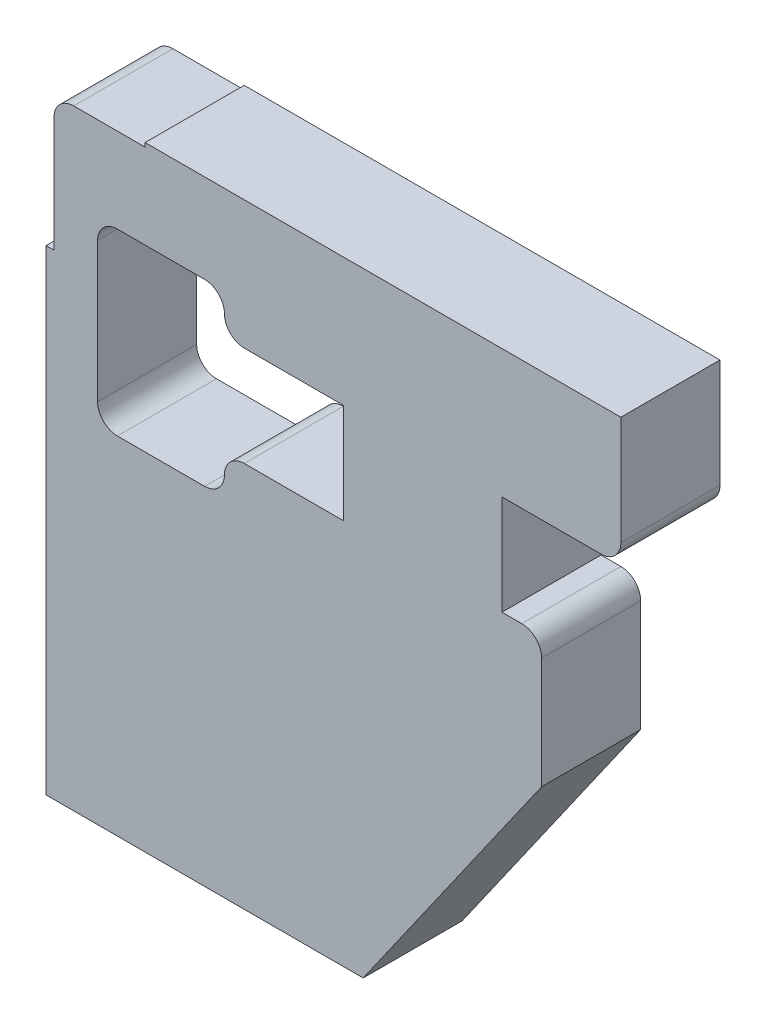
ISO-10303-21;
HEADER;
FILE_DESCRIPTION(('STEP AP214'),'2;1');
FILE_NAME('part.step','',(''),(''),'','','');
FILE_SCHEMA(('AUTOMOTIVE_DESIGN { 1 0 10303 214 1 1 1 1 }'));
ENDSEC;
DATA;
#1=APPLICATION_CONTEXT('core data for automotive mechanical design processes');
#2=APPLICATION_PROTOCOL_DEFINITION('international standard','automotive_design',2000,#1);
#3=PRODUCT_CONTEXT('',#1,'mechanical');
#4=PRODUCT('Part','Part','',(#3));
#5=PRODUCT_RELATED_PRODUCT_CATEGORY('part','',(#4));
#6=PRODUCT_DEFINITION_FORMATION('','',#4);
#7=PRODUCT_DEFINITION_CONTEXT('part definition',#1,'design');
#8=PRODUCT_DEFINITION('design','',#6,#7);
#9=PRODUCT_DEFINITION_SHAPE('','',#8);
#10=(LENGTH_UNIT() NAMED_UNIT(*) SI_UNIT(.MILLI.,.METRE.));
#11=(NAMED_UNIT(*) PLANE_ANGLE_UNIT() SI_UNIT($,.RADIAN.));
#12=(NAMED_UNIT(*) SI_UNIT($,.STERADIAN.) SOLID_ANGLE_UNIT());
#13=UNCERTAINTY_MEASURE_WITH_UNIT(LENGTH_MEASURE(1.E-05),#10,'distance_accuracy_value','');
#14=(GEOMETRIC_REPRESENTATION_CONTEXT(3) GLOBAL_UNCERTAINTY_ASSIGNED_CONTEXT((#13)) GLOBAL_UNIT_ASSIGNED_CONTEXT((#10,
#11,#12)) REPRESENTATION_CONTEXT('',''));
#15=CARTESIAN_POINT('',(0.,0.,0.));
#16=DIRECTION('',(0.,0.,1.));
#17=DIRECTION('',(1.,0.,0.));
#18=AXIS2_PLACEMENT_3D('',#15,#16,#17);
#19=CARTESIAN_POINT('',(0.,0.,0.125));
#20=DIRECTION('',(0.,0.,-1.));
#21=DIRECTION('',(-1.,0.,0.));
#22=AXIS2_PLACEMENT_3D('',#19,#20,#21);
#23=PLANE('',#22);
#24=DIRECTION('',(0.,1.,0.));
#25=VECTOR('',#24,1.);
#26=CARTESIAN_POINT('',(1.3,-0.957333396966045,0.125));
#27=LINE('',#26,#25);
#28=CARTESIAN_POINT('',(1.3,-0.957333396966045,0.125));
#29=VERTEX_POINT('',#28);
#30=CARTESIAN_POINT('',(1.3,-0.676,0.125));
#31=VERTEX_POINT('',#30);
#32=EDGE_CURVE('E290',#29,#31,#27,.T.);
#33=ORIENTED_EDGE('',*,*,#32,.T.);
#34=CARTESIAN_POINT('',(1.25,-0.676,0.125));
#35=DIRECTION('',(0.,0.,-1.));
#36=DIRECTION('',(-1.,0.,0.));
#37=AXIS2_PLACEMENT_3D('',#34,#35,#36);
#38=CIRCLE('',#37,0.05);
#39=CARTESIAN_POINT('',(1.25,-0.626,0.125));
#40=VERTEX_POINT('',#39);
#41=EDGE_CURVE('E379',#31,#40,#38,.F.);
#42=ORIENTED_EDGE('',*,*,#41,.T.);
#43=DIRECTION('',(-1.,0.,0.));
#44=VECTOR('',#43,1.);
#45=CARTESIAN_POINT('',(1.3,-0.626,0.125));
#46=LINE('',#45,#44);
#47=CARTESIAN_POINT('',(1.2,-0.626,0.125));
#48=VERTEX_POINT('',#47);
#49=EDGE_CURVE('E293',#40,#48,#46,.T.);
#50=ORIENTED_EDGE('',*,*,#49,.T.);
#51=DIRECTION('',(0.,1.,0.));
#52=VECTOR('',#51,1.);
#53=CARTESIAN_POINT('',(1.2,-0.626,0.125));
#54=LINE('',#53,#52);
#55=CARTESIAN_POINT('',(1.2,-0.374,0.125));
#56=VERTEX_POINT('',#55);
#57=EDGE_CURVE('E295',#48,#56,#54,.T.);
#58=ORIENTED_EDGE('',*,*,#57,.T.);
#59=DIRECTION('',(1.,0.,0.));
#60=VECTOR('',#59,1.);
#61=CARTESIAN_POINT('',(1.2,-0.374,0.125));
#62=LINE('',#61,#60);
#63=CARTESIAN_POINT('',(1.45,-0.374,0.125));
#64=VERTEX_POINT('',#63);
#65=EDGE_CURVE('E297',#56,#64,#62,.T.);
#66=ORIENTED_EDGE('',*,*,#65,.T.);
#67=CARTESIAN_POINT('',(1.45,-0.324,0.125));
#68=DIRECTION('',(0.,0.,-1.));
#69=DIRECTION('',(-1.,0.,0.));
#70=AXIS2_PLACEMENT_3D('',#67,#68,#69);
#71=CIRCLE('',#70,0.05);
#72=CARTESIAN_POINT('',(1.5,-0.324,0.125));
#73=VERTEX_POINT('',#72);
#74=EDGE_CURVE('E377',#64,#73,#71,.F.);
#75=ORIENTED_EDGE('',*,*,#74,.T.);
#76=DIRECTION('',(0.,1.,0.));
#77=VECTOR('',#76,1.);
#78=CARTESIAN_POINT('',(1.5,-0.374,0.125));
#79=LINE('',#78,#77);
#80=CARTESIAN_POINT('',(1.5,-0.05,0.125));
#81=VERTEX_POINT('',#80);
#82=EDGE_CURVE('E270',#73,#81,#79,.T.);
#83=ORIENTED_EDGE('',*,*,#82,.T.);
#84=DIRECTION('',(-1.,0.,0.));
#85=VECTOR('',#84,1.);
#86=CARTESIAN_POINT('',(0.3,-0.05,0.125));
#87=LINE('',#86,#85);
#88=CARTESIAN_POINT('',(0.3,-0.05,0.125));
#89=VERTEX_POINT('',#88);
#90=EDGE_CURVE('E272',#81,#89,#87,.T.);
#91=ORIENTED_EDGE('',*,*,#90,.T.);
#92=DIRECTION('',(0.,-1.,0.));
#93=VECTOR('',#92,1.);
#94=CARTESIAN_POINT('',(0.3,-0.05,0.125));
#95=LINE('',#94,#93);
#96=CARTESIAN_POINT('',(0.3,-0.06,0.125));
#97=VERTEX_POINT('',#96);
#98=EDGE_CURVE('E275',#89,#97,#95,.T.);
#99=ORIENTED_EDGE('',*,*,#98,.T.);
#100=DIRECTION('',(-1.,0.,0.));
#101=VECTOR('',#100,1.);
#102=CARTESIAN_POINT('',(0.3,-0.06,0.125));
#103=LINE('',#102,#101);
#104=CARTESIAN_POINT('',(0.12,-0.06,0.125));
#105=VERTEX_POINT('',#104);
#106=EDGE_CURVE('E277',#97,#105,#103,.T.);
#107=ORIENTED_EDGE('',*,*,#106,.T.);
#108=CARTESIAN_POINT('',(0.12,-0.11,0.125));
#109=DIRECTION('',(0.,0.,-1.));
#110=DIRECTION('',(-1.,0.,0.));
#111=AXIS2_PLACEMENT_3D('',#108,#109,#110);
#112=CIRCLE('',#111,0.05);
#113=CARTESIAN_POINT('',(0.07,-0.11,0.125));
#114=VERTEX_POINT('',#113);
#115=EDGE_CURVE('E372',#105,#114,#112,.F.);
#116=ORIENTED_EDGE('',*,*,#115,.T.);
#117=DIRECTION('',(0.,-1.,0.));
#118=VECTOR('',#117,1.);
#119=CARTESIAN_POINT('',(0.07,-0.06,0.125));
#120=LINE('',#119,#118);
#121=CARTESIAN_POINT('',(0.07,-0.4,0.125));
#122=VERTEX_POINT('',#121);
#123=EDGE_CURVE('E280',#114,#122,#120,.T.);
#124=ORIENTED_EDGE('',*,*,#123,.T.);
#125=DIRECTION('',(-1.,0.,0.));
#126=VECTOR('',#125,1.);
#127=CARTESIAN_POINT('',(0.05,-0.4,0.125));
#128=LINE('',#127,#126);
#129=CARTESIAN_POINT('',(0.05,-0.4,0.125));
#130=VERTEX_POINT('',#129);
#131=EDGE_CURVE('E282',#122,#130,#128,.T.);
#132=ORIENTED_EDGE('',*,*,#131,.T.);
#133=DIRECTION('',(0.,-1.,0.));
#134=VECTOR('',#133,1.);
#135=CARTESIAN_POINT('',(0.05,-0.4,0.125));
#136=LINE('',#135,#134);
#137=CARTESIAN_POINT('',(0.0500000000000001,-1.6,0.125));
#138=VERTEX_POINT('',#137);
#139=EDGE_CURVE('E284',#130,#138,#136,.T.);
#140=ORIENTED_EDGE('',*,*,#139,.T.);
#141=DIRECTION('',(1.,0.,0.));
#142=VECTOR('',#141,1.);
#143=CARTESIAN_POINT('',(0.0500000000000001,-1.6,0.125));
#144=LINE('',#143,#142);
#145=CARTESIAN_POINT('',(0.85,-1.6,0.125));
#146=VERTEX_POINT('',#145);
#147=EDGE_CURVE('E286',#138,#146,#144,.T.);
#148=ORIENTED_EDGE('',*,*,#147,.T.);
#149=DIRECTION('',(0.573576436351044,0.819152044288993,0.));
#150=VECTOR('',#149,1.);
#151=CARTESIAN_POINT('',(0.85,-1.6,0.125));
#152=LINE('',#151,#150);
#153=EDGE_CURVE('E288',#146,#29,#152,.T.);
#154=ORIENTED_EDGE('',*,*,#153,.T.);
#155=EDGE_LOOP('',(#33,#42,#50,#58,#66,#75,#83,#91,#99,#107,#116,#124,#132,#140,#148,#154));
#156=FACE_BOUND('',#155,.T.);
#157=DIRECTION('',(-1.,0.,0.));
#158=VECTOR('',#157,1.);
#159=CARTESIAN_POINT('',(0.18,-0.274,0.125));
#160=LINE('',#159,#158);
#161=CARTESIAN_POINT('',(0.45,-0.274,0.125));
#162=VERTEX_POINT('',#161);
#163=CARTESIAN_POINT('',(0.23,-0.274,0.125));
#164=VERTEX_POINT('',#163);
#165=EDGE_CURVE('E243',#162,#164,#160,.T.);
#166=ORIENTED_EDGE('',*,*,#165,.F.);
#167=CARTESIAN_POINT('',(0.45,-0.324,0.125));
#168=DIRECTION('',(0.,0.,-1.));
#169=DIRECTION('',(-1.,0.,0.));
#170=AXIS2_PLACEMENT_3D('',#167,#168,#169);
#171=CIRCLE('',#170,0.05);
#172=CARTESIAN_POINT('',(0.5,-0.324,0.125));
#173=VERTEX_POINT('',#172);
#174=EDGE_CURVE('E55',#162,#173,#171,.T.);
#175=ORIENTED_EDGE('',*,*,#174,.T.);
#176=CARTESIAN_POINT('',(0.55,-0.324,0.125));
#177=DIRECTION('',(0.,0.,-1.));
#178=DIRECTION('',(-1.,0.,0.));
#179=AXIS2_PLACEMENT_3D('',#176,#177,#178);
#180=CIRCLE('',#179,0.05);
#181=CARTESIAN_POINT('',(0.55,-0.374,0.125));
#182=VERTEX_POINT('',#181);
#183=EDGE_CURVE('E50',#173,#182,#180,.F.);
#184=ORIENTED_EDGE('',*,*,#183,.T.);
#185=DIRECTION('',(-1.,0.,0.));
#186=VECTOR('',#185,1.);
#187=CARTESIAN_POINT('',(0.5,-0.374,0.125));
#188=LINE('',#187,#186);
#189=CARTESIAN_POINT('',(0.8,-0.374,0.125));
#190=VERTEX_POINT('',#189);
#191=EDGE_CURVE('E241',#190,#182,#188,.T.);
#192=ORIENTED_EDGE('',*,*,#191,.F.);
#193=DIRECTION('',(0.,1.,0.));
#194=VECTOR('',#193,1.);
#195=CARTESIAN_POINT('',(0.8,-0.374,0.125));
#196=LINE('',#195,#194);
#197=CARTESIAN_POINT('',(0.8,-0.626,0.125));
#198=VERTEX_POINT('',#197);
#199=EDGE_CURVE('E229',#198,#190,#196,.T.);
#200=ORIENTED_EDGE('',*,*,#199,.F.);
#201=DIRECTION('',(1.,0.,0.));
#202=VECTOR('',#201,1.);
#203=CARTESIAN_POINT('',(0.8,-0.626,0.125));
#204=LINE('',#203,#202);
#205=CARTESIAN_POINT('',(0.55,-0.626,0.125));
#206=VERTEX_POINT('',#205);
#207=EDGE_CURVE('E221',#206,#198,#204,.T.);
#208=ORIENTED_EDGE('',*,*,#207,.F.);
#209=CARTESIAN_POINT('',(0.55,-0.676,0.125));
#210=DIRECTION('',(0.,0.,-1.));
#211=DIRECTION('',(-1.,0.,0.));
#212=AXIS2_PLACEMENT_3D('',#209,#210,#211);
#213=CIRCLE('',#212,0.05);
#214=CARTESIAN_POINT('',(0.5,-0.676,0.125));
#215=VERTEX_POINT('',#214);
#216=EDGE_CURVE('E374',#206,#215,#213,.F.);
#217=ORIENTED_EDGE('',*,*,#216,.T.);
#218=CARTESIAN_POINT('',(0.45,-0.676,0.125));
#219=DIRECTION('',(0.,0.,-1.));
#220=DIRECTION('',(-1.,0.,0.));
#221=AXIS2_PLACEMENT_3D('',#218,#219,#220);
#222=CIRCLE('',#221,0.05);
#223=CARTESIAN_POINT('',(0.45,-0.726,0.125));
#224=VERTEX_POINT('',#223);
#225=EDGE_CURVE('E411',#215,#224,#222,.T.);
#226=ORIENTED_EDGE('',*,*,#225,.T.);
#227=DIRECTION('',(1.,0.,0.));
#228=VECTOR('',#227,1.);
#229=CARTESIAN_POINT('',(0.5,-0.726,0.125));
#230=LINE('',#229,#228);
#231=CARTESIAN_POINT('',(0.23,-0.726,0.125));
#232=VERTEX_POINT('',#231);
#233=EDGE_CURVE('E251',#232,#224,#230,.T.);
#234=ORIENTED_EDGE('',*,*,#233,.F.);
#235=CARTESIAN_POINT('',(0.23,-0.676,0.125));
#236=DIRECTION('',(0.,0.,-1.));
#237=DIRECTION('',(-1.,0.,0.));
#238=AXIS2_PLACEMENT_3D('',#235,#236,#237);
#239=CIRCLE('',#238,0.05);
#240=CARTESIAN_POINT('',(0.18,-0.676,0.125));
#241=VERTEX_POINT('',#240);
#242=EDGE_CURVE('E415',#232,#241,#239,.T.);
#243=ORIENTED_EDGE('',*,*,#242,.T.);
#244=DIRECTION('',(0.,-1.,0.));
#245=VECTOR('',#244,1.);
#246=CARTESIAN_POINT('',(0.18,-0.726,0.125));
#247=LINE('',#246,#245);
#248=CARTESIAN_POINT('',(0.18,-0.324,0.125));
#249=VERTEX_POINT('',#248);
#250=EDGE_CURVE('E248',#249,#241,#247,.T.);
#251=ORIENTED_EDGE('',*,*,#250,.F.);
#252=CARTESIAN_POINT('',(0.23,-0.324,0.125));
#253=DIRECTION('',(0.,0.,-1.));
#254=DIRECTION('',(-1.,0.,0.));
#255=AXIS2_PLACEMENT_3D('',#252,#253,#254);
#256=CIRCLE('',#255,0.05);
#257=EDGE_CURVE('E11',#249,#164,#256,.T.);
#258=ORIENTED_EDGE('',*,*,#257,.T.);
#259=EDGE_LOOP('',(#166,#175,#184,#192,#200,#208,#217,#226,#234,#243,#251,#258));
#260=FACE_BOUND('',#259,.T.);
#261=ADVANCED_FACE('F33',(#156,#260),#23,.F.);
#262=CARTESIAN_POINT('',(0.,0.,-0.125));
#263=DIRECTION('',(0.,0.,-1.));
#264=DIRECTION('',(-1.,0.,0.));
#265=AXIS2_PLACEMENT_3D('',#262,#263,#264);
#266=PLANE('',#265);
#267=DIRECTION('',(-1.,0.,0.));
#268=VECTOR('',#267,1.);
#269=CARTESIAN_POINT('',(1.3,-0.626,-0.125));
#270=LINE('',#269,#268);
#271=CARTESIAN_POINT('',(1.25,-0.626,-0.125));
#272=VERTEX_POINT('',#271);
#273=CARTESIAN_POINT('',(1.2,-0.626,-0.125));
#274=VERTEX_POINT('',#273);
#275=EDGE_CURVE('E322',#272,#274,#270,.T.);
#276=ORIENTED_EDGE('',*,*,#275,.F.);
#277=CARTESIAN_POINT('',(1.25,-0.676,-0.125));
#278=DIRECTION('',(0.,0.,-1.));
#279=DIRECTION('',(-1.,0.,0.));
#280=AXIS2_PLACEMENT_3D('',#277,#278,#279);
#281=CIRCLE('',#280,0.05);
#282=CARTESIAN_POINT('',(1.3,-0.676,-0.125));
#283=VERTEX_POINT('',#282);
#284=EDGE_CURVE('E368',#272,#283,#281,.T.);
#285=ORIENTED_EDGE('',*,*,#284,.T.);
#286=DIRECTION('',(0.,1.,0.));
#287=VECTOR('',#286,1.);
#288=CARTESIAN_POINT('',(1.3,-0.957333396966045,-0.125));
#289=LINE('',#288,#287);
#290=CARTESIAN_POINT('',(1.3,-0.957333396966045,-0.125));
#291=VERTEX_POINT('',#290);
#292=EDGE_CURVE('E319',#291,#283,#289,.T.);
#293=ORIENTED_EDGE('',*,*,#292,.F.);
#294=DIRECTION('',(0.573576436351044,0.819152044288993,0.));
#295=VECTOR('',#294,1.);
#296=CARTESIAN_POINT('',(0.85,-1.6,-0.125));
#297=LINE('',#296,#295);
#298=CARTESIAN_POINT('',(0.85,-1.6,-0.125));
#299=VERTEX_POINT('',#298);
#300=EDGE_CURVE('E317',#299,#291,#297,.T.);
#301=ORIENTED_EDGE('',*,*,#300,.F.);
#302=DIRECTION('',(1.,0.,0.));
#303=VECTOR('',#302,1.);
#304=CARTESIAN_POINT('',(0.0500000000000001,-1.6,-0.125));
#305=LINE('',#304,#303);
#306=CARTESIAN_POINT('',(0.0500000000000001,-1.6,-0.125));
#307=VERTEX_POINT('',#306);
#308=EDGE_CURVE('E315',#307,#299,#305,.T.);
#309=ORIENTED_EDGE('',*,*,#308,.F.);
#310=DIRECTION('',(0.,-1.,0.));
#311=VECTOR('',#310,1.);
#312=CARTESIAN_POINT('',(0.05,-0.4,-0.125));
#313=LINE('',#312,#311);
#314=CARTESIAN_POINT('',(0.05,-0.4,-0.125));
#315=VERTEX_POINT('',#314);
#316=EDGE_CURVE('E313',#315,#307,#313,.T.);
#317=ORIENTED_EDGE('',*,*,#316,.F.);
#318=DIRECTION('',(-1.,0.,0.));
#319=VECTOR('',#318,1.);
#320=CARTESIAN_POINT('',(0.05,-0.4,-0.125));
#321=LINE('',#320,#319);
#322=CARTESIAN_POINT('',(0.07,-0.4,-0.125));
#323=VERTEX_POINT('',#322);
#324=EDGE_CURVE('E311',#323,#315,#321,.T.);
#325=ORIENTED_EDGE('',*,*,#324,.F.);
#326=DIRECTION('',(0.,-1.,0.));
#327=VECTOR('',#326,1.);
#328=CARTESIAN_POINT('',(0.07,-0.06,-0.125));
#329=LINE('',#328,#327);
#330=CARTESIAN_POINT('',(0.07,-0.11,-0.125));
#331=VERTEX_POINT('',#330);
#332=EDGE_CURVE('E309',#331,#323,#329,.T.);
#333=ORIENTED_EDGE('',*,*,#332,.F.);
#334=CARTESIAN_POINT('',(0.12,-0.11,-0.125));
#335=DIRECTION('',(0.,0.,-1.));
#336=DIRECTION('',(-1.,0.,0.));
#337=AXIS2_PLACEMENT_3D('',#334,#335,#336);
#338=CIRCLE('',#337,0.05);
#339=CARTESIAN_POINT('',(0.12,-0.06,-0.125));
#340=VERTEX_POINT('',#339);
#341=EDGE_CURVE('E360',#331,#340,#338,.T.);
#342=ORIENTED_EDGE('',*,*,#341,.T.);
#343=DIRECTION('',(-1.,0.,0.));
#344=VECTOR('',#343,1.);
#345=CARTESIAN_POINT('',(0.3,-0.06,-0.125));
#346=LINE('',#345,#344);
#347=CARTESIAN_POINT('',(0.3,-0.06,-0.125));
#348=VERTEX_POINT('',#347);
#349=EDGE_CURVE('E306',#348,#340,#346,.T.);
#350=ORIENTED_EDGE('',*,*,#349,.F.);
#351=DIRECTION('',(0.,-1.,0.));
#352=VECTOR('',#351,1.);
#353=CARTESIAN_POINT('',(0.3,-0.05,-0.125));
#354=LINE('',#353,#352);
#355=CARTESIAN_POINT('',(0.3,-0.05,-0.125));
#356=VERTEX_POINT('',#355);
#357=EDGE_CURVE('E304',#356,#348,#354,.T.);
#358=ORIENTED_EDGE('',*,*,#357,.F.);
#359=DIRECTION('',(-1.,0.,0.));
#360=VECTOR('',#359,1.);
#361=CARTESIAN_POINT('',(0.3,-0.05,-0.125));
#362=LINE('',#361,#360);
#363=CARTESIAN_POINT('',(1.5,-0.05,-0.125));
#364=VERTEX_POINT('',#363);
#365=EDGE_CURVE('E302',#364,#356,#362,.T.);
#366=ORIENTED_EDGE('',*,*,#365,.F.);
#367=DIRECTION('',(0.,1.,0.));
#368=VECTOR('',#367,1.);
#369=CARTESIAN_POINT('',(1.5,-0.374,-0.125));
#370=LINE('',#369,#368);
#371=CARTESIAN_POINT('',(1.5,-0.324,-0.125));
#372=VERTEX_POINT('',#371);
#373=EDGE_CURVE('E238',#372,#364,#370,.T.);
#374=ORIENTED_EDGE('',*,*,#373,.F.);
#375=CARTESIAN_POINT('',(1.45,-0.324,-0.125));
#376=DIRECTION('',(0.,0.,-1.));
#377=DIRECTION('',(-1.,0.,0.));
#378=AXIS2_PLACEMENT_3D('',#375,#376,#377);
#379=CIRCLE('',#378,0.05);
#380=CARTESIAN_POINT('',(1.45,-0.374,-0.125));
#381=VERTEX_POINT('',#380);
#382=EDGE_CURVE('E366',#372,#381,#379,.T.);
#383=ORIENTED_EDGE('',*,*,#382,.T.);
#384=DIRECTION('',(1.,0.,0.));
#385=VECTOR('',#384,1.);
#386=CARTESIAN_POINT('',(1.2,-0.374,-0.125));
#387=LINE('',#386,#385);
#388=CARTESIAN_POINT('',(1.2,-0.374,-0.125));
#389=VERTEX_POINT('',#388);
#390=EDGE_CURVE('E273',#389,#381,#387,.T.);
#391=ORIENTED_EDGE('',*,*,#390,.F.);
#392=DIRECTION('',(0.,1.,0.));
#393=VECTOR('',#392,1.);
#394=CARTESIAN_POINT('',(1.2,-0.626,-0.125));
#395=LINE('',#394,#393);
#396=EDGE_CURVE('E324',#274,#389,#395,.T.);
#397=ORIENTED_EDGE('',*,*,#396,.F.);
#398=EDGE_LOOP('',(#276,#285,#293,#301,#309,#317,#325,#333,#342,#350,#358,#366,#374,#383,#391,#397));
#399=FACE_BOUND('',#398,.T.);
#400=DIRECTION('',(-1.,0.,0.));
#401=VECTOR('',#400,1.);
#402=CARTESIAN_POINT('',(0.5,-0.374,-0.125));
#403=LINE('',#402,#401);
#404=CARTESIAN_POINT('',(0.8,-0.374,-0.125));
#405=VERTEX_POINT('',#404);
#406=CARTESIAN_POINT('',(0.55,-0.374,-0.125));
#407=VERTEX_POINT('',#406);
#408=EDGE_CURVE('E258',#405,#407,#403,.T.);
#409=ORIENTED_EDGE('',*,*,#408,.T.);
#410=CARTESIAN_POINT('',(0.55,-0.324,-0.125));
#411=DIRECTION('',(0.,0.,-1.));
#412=DIRECTION('',(-1.,0.,0.));
#413=AXIS2_PLACEMENT_3D('',#410,#411,#412);
#414=CIRCLE('',#413,0.05);
#415=CARTESIAN_POINT('',(0.5,-0.324,-0.125));
#416=VERTEX_POINT('',#415);
#417=EDGE_CURVE('E364',#407,#416,#414,.T.);
#418=ORIENTED_EDGE('',*,*,#417,.T.);
#419=CARTESIAN_POINT('',(0.45,-0.324,-0.125));
#420=DIRECTION('',(0.,0.,-1.));
#421=DIRECTION('',(-1.,0.,0.));
#422=AXIS2_PLACEMENT_3D('',#419,#420,#421);
#423=CIRCLE('',#422,0.05);
#424=CARTESIAN_POINT('',(0.45,-0.274,-0.125));
#425=VERTEX_POINT('',#424);
#426=EDGE_CURVE('E417',#416,#425,#423,.F.);
#427=ORIENTED_EDGE('',*,*,#426,.T.);
#428=DIRECTION('',(-1.,0.,0.));
#429=VECTOR('',#428,1.);
#430=CARTESIAN_POINT('',(0.18,-0.274,-0.125));
#431=LINE('',#430,#429);
#432=CARTESIAN_POINT('',(0.23,-0.274,-0.125));
#433=VERTEX_POINT('',#432);
#434=EDGE_CURVE('E261',#425,#433,#431,.T.);
#435=ORIENTED_EDGE('',*,*,#434,.T.);
#436=CARTESIAN_POINT('',(0.23,-0.324,-0.125));
#437=DIRECTION('',(0.,0.,-1.));
#438=DIRECTION('',(-1.,0.,0.));
#439=AXIS2_PLACEMENT_3D('',#436,#437,#438);
#440=CIRCLE('',#439,0.05);
#441=CARTESIAN_POINT('',(0.18,-0.324,-0.125));
#442=VERTEX_POINT('',#441);
#443=EDGE_CURVE('E42',#433,#442,#440,.F.);
#444=ORIENTED_EDGE('',*,*,#443,.T.);
#445=DIRECTION('',(0.,-1.,0.));
#446=VECTOR('',#445,1.);
#447=CARTESIAN_POINT('',(0.18,-0.726,-0.125));
#448=LINE('',#447,#446);
#449=CARTESIAN_POINT('',(0.18,-0.676,-0.125));
#450=VERTEX_POINT('',#449);
#451=EDGE_CURVE('E264',#442,#450,#448,.T.);
#452=ORIENTED_EDGE('',*,*,#451,.T.);
#453=CARTESIAN_POINT('',(0.23,-0.676,-0.125));
#454=DIRECTION('',(0.,0.,-1.));
#455=DIRECTION('',(-1.,0.,0.));
#456=AXIS2_PLACEMENT_3D('',#453,#454,#455);
#457=CIRCLE('',#456,0.05);
#458=CARTESIAN_POINT('',(0.23,-0.726,-0.125));
#459=VERTEX_POINT('',#458);
#460=EDGE_CURVE('E413',#450,#459,#457,.F.);
#461=ORIENTED_EDGE('',*,*,#460,.T.);
#462=DIRECTION('',(1.,0.,0.));
#463=VECTOR('',#462,1.);
#464=CARTESIAN_POINT('',(0.5,-0.726,-0.125));
#465=LINE('',#464,#463);
#466=CARTESIAN_POINT('',(0.45,-0.726,-0.125));
#467=VERTEX_POINT('',#466);
#468=EDGE_CURVE('E230',#459,#467,#465,.T.);
#469=ORIENTED_EDGE('',*,*,#468,.T.);
#470=CARTESIAN_POINT('',(0.45,-0.676,-0.125));
#471=DIRECTION('',(0.,0.,-1.));
#472=DIRECTION('',(-1.,0.,0.));
#473=AXIS2_PLACEMENT_3D('',#470,#471,#472);
#474=CIRCLE('',#473,0.05);
#475=CARTESIAN_POINT('',(0.5,-0.676,-0.125));
#476=VERTEX_POINT('',#475);
#477=EDGE_CURVE('E409',#467,#476,#474,.F.);
#478=ORIENTED_EDGE('',*,*,#477,.T.);
#479=CARTESIAN_POINT('',(0.55,-0.676,-0.125));
#480=DIRECTION('',(0.,0.,-1.));
#481=DIRECTION('',(-1.,0.,0.));
#482=AXIS2_PLACEMENT_3D('',#479,#480,#481);
#483=CIRCLE('',#482,0.05);
#484=CARTESIAN_POINT('',(0.55,-0.626,-0.125));
#485=VERTEX_POINT('',#484);
#486=EDGE_CURVE('E362',#476,#485,#483,.T.);
#487=ORIENTED_EDGE('',*,*,#486,.T.);
#488=DIRECTION('',(1.,0.,0.));
#489=VECTOR('',#488,1.);
#490=CARTESIAN_POINT('',(0.8,-0.626,-0.125));
#491=LINE('',#490,#489);
#492=CARTESIAN_POINT('',(0.8,-0.626,-0.125));
#493=VERTEX_POINT('',#492);
#494=EDGE_CURVE('E254',#485,#493,#491,.T.);
#495=ORIENTED_EDGE('',*,*,#494,.T.);
#496=DIRECTION('',(0.,1.,0.));
#497=VECTOR('',#496,1.);
#498=CARTESIAN_POINT('',(0.8,-0.374,-0.125));
#499=LINE('',#498,#497);
#500=EDGE_CURVE('E237',#493,#405,#499,.T.);
#501=ORIENTED_EDGE('',*,*,#500,.T.);
#502=EDGE_LOOP('',(#409,#418,#427,#435,#444,#452,#461,#469,#478,#487,#495,#501));
#503=FACE_BOUND('',#502,.T.);
#504=ADVANCED_FACE('F463',(#399,#503),#266,.T.);
#505=CARTESIAN_POINT('',(1.5,-0.374,0.125));
#506=DIRECTION('',(-1.,0.,0.));
#507=DIRECTION('',(0.,-1.,0.));
#508=AXIS2_PLACEMENT_3D('',#505,#506,#507);
#509=PLANE('',#508);
#510=ORIENTED_EDGE('',*,*,#82,.F.);
#511=DIRECTION('',(0.,0.,-1.));
#512=VECTOR('',#511,1.);
#513=CARTESIAN_POINT('',(1.5,-0.324,0.125));
#514=LINE('',#513,#512);
#515=EDGE_CURVE('E381',#73,#372,#514,.T.);
#516=ORIENTED_EDGE('',*,*,#515,.T.);
#517=ORIENTED_EDGE('',*,*,#373,.T.);
#518=DIRECTION('',(0.,0.,-1.));
#519=VECTOR('',#518,1.);
#520=CARTESIAN_POINT('',(1.5,-0.05,0.125));
#521=LINE('',#520,#519);
#522=EDGE_CURVE('E354',#81,#364,#521,.T.);
#523=ORIENTED_EDGE('',*,*,#522,.F.);
#524=EDGE_LOOP('',(#510,#516,#517,#523));
#525=FACE_BOUND('',#524,.T.);
#526=ADVANCED_FACE('F465',(#525),#509,.F.);
#527=CARTESIAN_POINT('',(0.3,-0.05,0.125));
#528=DIRECTION('',(0.,-1.,0.));
#529=DIRECTION('',(1.,0.,0.));
#530=AXIS2_PLACEMENT_3D('',#527,#528,#529);
#531=PLANE('',#530);
#532=ORIENTED_EDGE('',*,*,#365,.T.);
#533=DIRECTION('',(0.,0.,-1.));
#534=VECTOR('',#533,1.);
#535=CARTESIAN_POINT('',(0.3,-0.05,0.125));
#536=LINE('',#535,#534);
#537=EDGE_CURVE('E351',#89,#356,#536,.T.);
#538=ORIENTED_EDGE('',*,*,#537,.F.);
#539=ORIENTED_EDGE('',*,*,#90,.F.);
#540=ORIENTED_EDGE('',*,*,#522,.T.);
#541=EDGE_LOOP('',(#532,#538,#539,#540));
#542=FACE_BOUND('',#541,.T.);
#543=ADVANCED_FACE('F472',(#542),#531,.F.);
#544=CARTESIAN_POINT('',(0.3,-0.05,0.125));
#545=DIRECTION('',(1.,0.,0.));
#546=DIRECTION('',(0.,0.,-1.));
#547=AXIS2_PLACEMENT_3D('',#544,#545,#546);
#548=PLANE('',#547);
#549=ORIENTED_EDGE('',*,*,#357,.T.);
#550=DIRECTION('',(0.,0.,-1.));
#551=VECTOR('',#550,1.);
#552=CARTESIAN_POINT('',(0.3,-0.06,0.125));
#553=LINE('',#552,#551);
#554=EDGE_CURVE('E348',#97,#348,#553,.T.);
#555=ORIENTED_EDGE('',*,*,#554,.F.);
#556=ORIENTED_EDGE('',*,*,#98,.F.);
#557=ORIENTED_EDGE('',*,*,#537,.T.);
#558=EDGE_LOOP('',(#549,#555,#556,#557));
#559=FACE_BOUND('',#558,.T.);
#560=ADVANCED_FACE('F519',(#559),#548,.F.);
#561=CARTESIAN_POINT('',(0.3,-0.06,0.125));
#562=DIRECTION('',(0.,-1.,0.));
#563=DIRECTION('',(0.,0.,-1.));
#564=AXIS2_PLACEMENT_3D('',#561,#562,#563);
#565=PLANE('',#564);
#566=ORIENTED_EDGE('',*,*,#349,.T.);
#567=DIRECTION('',(0.,0.,-1.));
#568=VECTOR('',#567,1.);
#569=CARTESIAN_POINT('',(0.12,-0.06,0.125));
#570=LINE('',#569,#568);
#571=EDGE_CURVE('E407',#340,#105,#570,.F.);
#572=ORIENTED_EDGE('',*,*,#571,.T.);
#573=ORIENTED_EDGE('',*,*,#106,.F.);
#574=ORIENTED_EDGE('',*,*,#554,.T.);
#575=EDGE_LOOP('',(#566,#572,#573,#574));
#576=FACE_BOUND('',#575,.T.);
#577=ADVANCED_FACE('F515',(#576),#565,.F.);
#578=CARTESIAN_POINT('',(0.07,-0.06,0.125));
#579=DIRECTION('',(1.,0.,0.));
#580=DIRECTION('',(0.,0.,-1.));
#581=AXIS2_PLACEMENT_3D('',#578,#579,#580);
#582=PLANE('',#581);
#583=ORIENTED_EDGE('',*,*,#123,.F.);
#584=DIRECTION('',(0.,0.,-1.));
#585=VECTOR('',#584,1.);
#586=CARTESIAN_POINT('',(0.07,-0.11,0.125));
#587=LINE('',#586,#585);
#588=EDGE_CURVE('E404',#114,#331,#587,.T.);
#589=ORIENTED_EDGE('',*,*,#588,.T.);
#590=ORIENTED_EDGE('',*,*,#332,.T.);
#591=DIRECTION('',(0.,0.,-1.));
#592=VECTOR('',#591,1.);
#593=CARTESIAN_POINT('',(0.07,-0.4,0.125));
#594=LINE('',#593,#592);
#595=EDGE_CURVE('E345',#122,#323,#594,.T.);
#596=ORIENTED_EDGE('',*,*,#595,.F.);
#597=EDGE_LOOP('',(#583,#589,#590,#596));
#598=FACE_BOUND('',#597,.T.);
#599=ADVANCED_FACE('F511',(#598),#582,.F.);
#600=CARTESIAN_POINT('',(0.05,-0.4,0.125));
#601=DIRECTION('',(0.,-1.,0.));
#602=DIRECTION('',(0.,0.,-1.));
#603=AXIS2_PLACEMENT_3D('',#600,#601,#602);
#604=PLANE('',#603);
#605=ORIENTED_EDGE('',*,*,#324,.T.);
#606=DIRECTION('',(0.,0.,-1.));
#607=VECTOR('',#606,1.);
#608=CARTESIAN_POINT('',(0.05,-0.4,0.125));
#609=LINE('',#608,#607);
#610=EDGE_CURVE('E342',#130,#315,#609,.T.);
#611=ORIENTED_EDGE('',*,*,#610,.F.);
#612=ORIENTED_EDGE('',*,*,#131,.F.);
#613=ORIENTED_EDGE('',*,*,#595,.T.);
#614=EDGE_LOOP('',(#605,#611,#612,#613));
#615=FACE_BOUND('',#614,.T.);
#616=ADVANCED_FACE('F507',(#615),#604,.F.);
#617=CARTESIAN_POINT('',(0.05,-0.4,0.125));
#618=DIRECTION('',(1.,0.,0.));
#619=DIRECTION('',(0.,1.,0.));
#620=AXIS2_PLACEMENT_3D('',#617,#618,#619);
#621=PLANE('',#620);
#622=ORIENTED_EDGE('',*,*,#316,.T.);
#623=DIRECTION('',(0.,0.,-1.));
#624=VECTOR('',#623,1.);
#625=CARTESIAN_POINT('',(0.0500000000000001,-1.6,0.125));
#626=LINE('',#625,#624);
#627=EDGE_CURVE('E339',#138,#307,#626,.T.);
#628=ORIENTED_EDGE('',*,*,#627,.F.);
#629=ORIENTED_EDGE('',*,*,#139,.F.);
#630=ORIENTED_EDGE('',*,*,#610,.T.);
#631=EDGE_LOOP('',(#622,#628,#629,#630));
#632=FACE_BOUND('',#631,.T.);
#633=ADVANCED_FACE('F503',(#632),#621,.F.);
#634=CARTESIAN_POINT('',(0.0500000000000001,-1.6,0.125));
#635=DIRECTION('',(0.,1.,0.));
#636=DIRECTION('',(0.,0.,1.));
#637=AXIS2_PLACEMENT_3D('',#634,#635,#636);
#638=PLANE('',#637);
#639=ORIENTED_EDGE('',*,*,#308,.T.);
#640=DIRECTION('',(0.,0.,-1.));
#641=VECTOR('',#640,1.);
#642=CARTESIAN_POINT('',(0.85,-1.6,0.125));
#643=LINE('',#642,#641);
#644=EDGE_CURVE('E336',#146,#299,#643,.T.);
#645=ORIENTED_EDGE('',*,*,#644,.F.);
#646=ORIENTED_EDGE('',*,*,#147,.F.);
#647=ORIENTED_EDGE('',*,*,#627,.T.);
#648=EDGE_LOOP('',(#639,#645,#646,#647));
#649=FACE_BOUND('',#648,.T.);
#650=ADVANCED_FACE('F499',(#649),#638,.F.);
#651=CARTESIAN_POINT('',(0.85,-1.6,0.125));
#652=DIRECTION('',(-0.819152044288993,0.573576436351044,0.));
#653=DIRECTION('',(-0.573576436351044,-0.819152044288993,0.));
#654=AXIS2_PLACEMENT_3D('',#651,#652,#653);
#655=PLANE('',#654);
#656=ORIENTED_EDGE('',*,*,#300,.T.);
#657=DIRECTION('',(0.,0.,-1.));
#658=VECTOR('',#657,1.);
#659=CARTESIAN_POINT('',(1.3,-0.957333396966045,0.125));
#660=LINE('',#659,#658);
#661=EDGE_CURVE('E333',#29,#291,#660,.T.);
#662=ORIENTED_EDGE('',*,*,#661,.F.);
#663=ORIENTED_EDGE('',*,*,#153,.F.);
#664=ORIENTED_EDGE('',*,*,#644,.T.);
#665=EDGE_LOOP('',(#656,#662,#663,#664));
#666=FACE_BOUND('',#665,.T.);
#667=ADVANCED_FACE('F495',(#666),#655,.F.);
#668=CARTESIAN_POINT('',(1.3,-0.957333396966045,0.125));
#669=DIRECTION('',(-1.,0.,0.));
#670=DIRECTION('',(0.,-1.,0.));
#671=AXIS2_PLACEMENT_3D('',#668,#669,#670);
#672=PLANE('',#671);
#673=ORIENTED_EDGE('',*,*,#292,.T.);
#674=DIRECTION('',(0.,0.,-1.));
#675=VECTOR('',#674,1.);
#676=CARTESIAN_POINT('',(1.3,-0.676,0.125));
#677=LINE('',#676,#675);
#678=EDGE_CURVE('E370',#283,#31,#677,.F.);
#679=ORIENTED_EDGE('',*,*,#678,.T.);
#680=ORIENTED_EDGE('',*,*,#32,.F.);
#681=ORIENTED_EDGE('',*,*,#661,.T.);
#682=EDGE_LOOP('',(#673,#679,#680,#681));
#683=FACE_BOUND('',#682,.T.);
#684=ADVANCED_FACE('F491',(#683),#672,.F.);
#685=CARTESIAN_POINT('',(1.3,-0.626,0.125));
#686=DIRECTION('',(0.,-1.,0.));
#687=DIRECTION('',(0.,0.,-1.));
#688=AXIS2_PLACEMENT_3D('',#685,#686,#687);
#689=PLANE('',#688);
#690=ORIENTED_EDGE('',*,*,#49,.F.);
#691=DIRECTION('',(0.,0.,-1.));
#692=VECTOR('',#691,1.);
#693=CARTESIAN_POINT('',(1.25,-0.626,0.125));
#694=LINE('',#693,#692);
#695=EDGE_CURVE('E357',#40,#272,#694,.T.);
#696=ORIENTED_EDGE('',*,*,#695,.T.);
#697=ORIENTED_EDGE('',*,*,#275,.T.);
#698=DIRECTION('',(0.,0.,-1.));
#699=VECTOR('',#698,1.);
#700=CARTESIAN_POINT('',(1.2,-0.626,0.125));
#701=LINE('',#700,#699);
#702=EDGE_CURVE('E330',#48,#274,#701,.T.);
#703=ORIENTED_EDGE('',*,*,#702,.F.);
#704=EDGE_LOOP('',(#690,#696,#697,#703));
#705=FACE_BOUND('',#704,.T.);
#706=ADVANCED_FACE('F487',(#705),#689,.F.);
#707=CARTESIAN_POINT('',(1.2,-0.626,0.125));
#708=DIRECTION('',(-1.,0.,0.));
#709=DIRECTION('',(0.,0.,1.));
#710=AXIS2_PLACEMENT_3D('',#707,#708,#709);
#711=PLANE('',#710);
#712=ORIENTED_EDGE('',*,*,#396,.T.);
#713=DIRECTION('',(0.,0.,-1.));
#714=VECTOR('',#713,1.);
#715=CARTESIAN_POINT('',(1.2,-0.374,0.125));
#716=LINE('',#715,#714);
#717=EDGE_CURVE('E300',#56,#389,#716,.T.);
#718=ORIENTED_EDGE('',*,*,#717,.F.);
#719=ORIENTED_EDGE('',*,*,#57,.F.);
#720=ORIENTED_EDGE('',*,*,#702,.T.);
#721=EDGE_LOOP('',(#712,#718,#719,#720));
#722=FACE_BOUND('',#721,.T.);
#723=ADVANCED_FACE('F483',(#722),#711,.F.);
#724=CARTESIAN_POINT('',(1.2,-0.374,0.125));
#725=DIRECTION('',(0.,1.,0.));
#726=DIRECTION('',(0.,0.,1.));
#727=AXIS2_PLACEMENT_3D('',#724,#725,#726);
#728=PLANE('',#727);
#729=ORIENTED_EDGE('',*,*,#390,.T.);
#730=DIRECTION('',(0.,0.,-1.));
#731=VECTOR('',#730,1.);
#732=CARTESIAN_POINT('',(1.45,-0.374,0.125));
#733=LINE('',#732,#731);
#734=EDGE_CURVE('E384',#381,#64,#733,.F.);
#735=ORIENTED_EDGE('',*,*,#734,.T.);
#736=ORIENTED_EDGE('',*,*,#65,.F.);
#737=ORIENTED_EDGE('',*,*,#717,.T.);
#738=EDGE_LOOP('',(#729,#735,#736,#737));
#739=FACE_BOUND('',#738,.T.);
#740=ADVANCED_FACE('F480',(#739),#728,.F.);
#741=CARTESIAN_POINT('',(0.8,-0.626,0.125));
#742=DIRECTION('',(0.,1.,0.));
#743=DIRECTION('',(-1.,0.,0.));
#744=AXIS2_PLACEMENT_3D('',#741,#742,#743);
#745=PLANE('',#744);
#746=ORIENTED_EDGE('',*,*,#494,.F.);
#747=DIRECTION('',(0.,0.,-1.));
#748=VECTOR('',#747,1.);
#749=CARTESIAN_POINT('',(0.55,-0.626,0.125));
#750=LINE('',#749,#748);
#751=EDGE_CURVE('E227',#485,#206,#750,.F.);
#752=ORIENTED_EDGE('',*,*,#751,.T.);
#753=ORIENTED_EDGE('',*,*,#207,.T.);
#754=DIRECTION('',(0.,0.,-1.));
#755=VECTOR('',#754,1.);
#756=CARTESIAN_POINT('',(0.8,-0.626,0.125));
#757=LINE('',#756,#755);
#758=EDGE_CURVE('E225',#198,#493,#757,.T.);
#759=ORIENTED_EDGE('',*,*,#758,.T.);
#760=EDGE_LOOP('',(#746,#752,#753,#759));
#761=FACE_BOUND('',#760,.T.);
#762=ADVANCED_FACE('F224',(#761),#745,.T.);
#763=CARTESIAN_POINT('',(0.8,-0.374,0.125));
#764=DIRECTION('',(-1.,0.,0.));
#765=DIRECTION('',(0.,0.,1.));
#766=AXIS2_PLACEMENT_3D('',#763,#764,#765);
#767=PLANE('',#766);
#768=ORIENTED_EDGE('',*,*,#500,.F.);
#769=ORIENTED_EDGE('',*,*,#758,.F.);
#770=ORIENTED_EDGE('',*,*,#199,.T.);
#771=DIRECTION('',(0.,0.,-1.));
#772=VECTOR('',#771,1.);
#773=CARTESIAN_POINT('',(0.8,-0.374,0.125));
#774=LINE('',#773,#772);
#775=EDGE_CURVE('E239',#190,#405,#774,.T.);
#776=ORIENTED_EDGE('',*,*,#775,.T.);
#777=EDGE_LOOP('',(#768,#769,#770,#776));
#778=FACE_BOUND('',#777,.T.);
#779=ADVANCED_FACE('F234',(#778),#767,.T.);
#780=CARTESIAN_POINT('',(0.5,-0.374,0.125));
#781=DIRECTION('',(0.,-1.,0.));
#782=DIRECTION('',(1.,0.,0.));
#783=AXIS2_PLACEMENT_3D('',#780,#781,#782);
#784=PLANE('',#783);
#785=ORIENTED_EDGE('',*,*,#191,.T.);
#786=DIRECTION('',(0.,0.,-1.));
#787=VECTOR('',#786,1.);
#788=CARTESIAN_POINT('',(0.55,-0.374,0.125));
#789=LINE('',#788,#787);
#790=EDGE_CURVE('E386',#182,#407,#789,.T.);
#791=ORIENTED_EDGE('',*,*,#790,.T.);
#792=ORIENTED_EDGE('',*,*,#408,.F.);
#793=ORIENTED_EDGE('',*,*,#775,.F.);
#794=EDGE_LOOP('',(#785,#791,#792,#793));
#795=FACE_BOUND('',#794,.T.);
#796=ADVANCED_FACE('F461',(#795),#784,.T.);
#797=CARTESIAN_POINT('',(0.18,-0.274,0.125));
#798=DIRECTION('',(0.,-1.,0.));
#799=DIRECTION('',(1.,0.,0.));
#800=AXIS2_PLACEMENT_3D('',#797,#798,#799);
#801=PLANE('',#800);
#802=ORIENTED_EDGE('',*,*,#434,.F.);
#803=DIRECTION('',(0.,0.,-1.));
#804=VECTOR('',#803,1.);
#805=CARTESIAN_POINT('',(0.45,-0.274,0.125));
#806=LINE('',#805,#804);
#807=EDGE_CURVE('E402',#425,#162,#806,.F.);
#808=ORIENTED_EDGE('',*,*,#807,.T.);
#809=ORIENTED_EDGE('',*,*,#165,.T.);
#810=DIRECTION('',(0.,0.,-1.));
#811=VECTOR('',#810,1.);
#812=CARTESIAN_POINT('',(0.23,-0.274,-0.125));
#813=LINE('',#812,#811);
#814=EDGE_CURVE('E399',#164,#433,#813,.T.);
#815=ORIENTED_EDGE('',*,*,#814,.T.);
#816=EDGE_LOOP('',(#802,#808,#809,#815));
#817=FACE_BOUND('',#816,.T.);
#818=ADVANCED_FACE('F452',(#817),#801,.T.);
#819=CARTESIAN_POINT('',(0.18,-0.726,0.125));
#820=DIRECTION('',(1.,0.,0.));
#821=DIRECTION('',(0.,0.,-1.));
#822=AXIS2_PLACEMENT_3D('',#819,#820,#821);
#823=PLANE('',#822);
#824=ORIENTED_EDGE('',*,*,#250,.T.);
#825=DIRECTION('',(0.,0.,-1.));
#826=VECTOR('',#825,1.);
#827=CARTESIAN_POINT('',(0.18,-0.676,-0.125));
#828=LINE('',#827,#826);
#829=EDGE_CURVE('E396',#241,#450,#828,.T.);
#830=ORIENTED_EDGE('',*,*,#829,.T.);
#831=ORIENTED_EDGE('',*,*,#451,.F.);
#832=DIRECTION('',(0.,0.,-1.));
#833=VECTOR('',#832,1.);
#834=CARTESIAN_POINT('',(0.18,-0.324,0.125));
#835=LINE('',#834,#833);
#836=EDGE_CURVE('E394',#442,#249,#835,.F.);
#837=ORIENTED_EDGE('',*,*,#836,.T.);
#838=EDGE_LOOP('',(#824,#830,#831,#837));
#839=FACE_BOUND('',#838,.T.);
#840=ADVANCED_FACE('F444',(#839),#823,.T.);
#841=CARTESIAN_POINT('',(0.5,-0.726,0.125));
#842=DIRECTION('',(0.,1.,0.));
#843=DIRECTION('',(-1.,0.,0.));
#844=AXIS2_PLACEMENT_3D('',#841,#842,#843);
#845=PLANE('',#844);
#846=ORIENTED_EDGE('',*,*,#233,.T.);
#847=DIRECTION('',(0.,0.,-1.));
#848=VECTOR('',#847,1.);
#849=CARTESIAN_POINT('',(0.45,-0.726,-0.125));
#850=LINE('',#849,#848);
#851=EDGE_CURVE('E392',#224,#467,#850,.T.);
#852=ORIENTED_EDGE('',*,*,#851,.T.);
#853=ORIENTED_EDGE('',*,*,#468,.F.);
#854=DIRECTION('',(0.,0.,-1.));
#855=VECTOR('',#854,1.);
#856=CARTESIAN_POINT('',(0.23,-0.726,0.125));
#857=LINE('',#856,#855);
#858=EDGE_CURVE('E390',#459,#232,#857,.F.);
#859=ORIENTED_EDGE('',*,*,#858,.T.);
#860=EDGE_LOOP('',(#846,#852,#853,#859));
#861=FACE_BOUND('',#860,.T.);
#862=ADVANCED_FACE('F435',(#861),#845,.T.);
#863=CARTESIAN_POINT('',(1.25,-0.676,0.125));
#864=DIRECTION('',(0.,0.,-1.));
#865=DIRECTION('',(-1.,0.,0.));
#866=AXIS2_PLACEMENT_3D('',#863,#864,#865);
#867=CYLINDRICAL_SURFACE('',#866,0.05);
#868=ORIENTED_EDGE('',*,*,#41,.F.);
#869=ORIENTED_EDGE('',*,*,#678,.F.);
#870=ORIENTED_EDGE('',*,*,#284,.F.);
#871=ORIENTED_EDGE('',*,*,#695,.F.);
#872=EDGE_LOOP('',(#868,#869,#870,#871));
#873=FACE_BOUND('',#872,.T.);
#874=ADVANCED_FACE('F527',(#873),#867,.T.);
#875=CARTESIAN_POINT('',(1.45,-0.324,0.125));
#876=DIRECTION('',(0.,0.,-1.));
#877=DIRECTION('',(-1.,0.,0.));
#878=AXIS2_PLACEMENT_3D('',#875,#876,#877);
#879=CYLINDRICAL_SURFACE('',#878,0.05);
#880=ORIENTED_EDGE('',*,*,#74,.F.);
#881=ORIENTED_EDGE('',*,*,#734,.F.);
#882=ORIENTED_EDGE('',*,*,#382,.F.);
#883=ORIENTED_EDGE('',*,*,#515,.F.);
#884=EDGE_LOOP('',(#880,#881,#882,#883));
#885=FACE_BOUND('',#884,.T.);
#886=ADVANCED_FACE('F530',(#885),#879,.T.);
#887=CARTESIAN_POINT('',(0.45,-0.324,0.125));
#888=DIRECTION('',(0.,0.,1.));
#889=DIRECTION('',(1.,0.,0.));
#890=AXIS2_PLACEMENT_3D('',#887,#888,#889);
#891=CYLINDRICAL_SURFACE('',#890,0.05);
#892=DIRECTION('',(0.,0.,-1.));
#893=VECTOR('',#892,1.);
#894=CARTESIAN_POINT('',(0.5,-0.324,-0.125));
#895=LINE('',#894,#893);
#896=EDGE_CURVE('E256',#173,#416,#895,.T.);
#897=ORIENTED_EDGE('',*,*,#896,.F.);
#898=ORIENTED_EDGE('',*,*,#174,.F.);
#899=ORIENTED_EDGE('',*,*,#807,.F.);
#900=ORIENTED_EDGE('',*,*,#426,.F.);
#901=EDGE_LOOP('',(#897,#898,#899,#900));
#902=FACE_BOUND('',#901,.T.);
#903=ADVANCED_FACE('F456',(#902),#891,.F.);
#904=CARTESIAN_POINT('',(0.55,-0.324,0.125));
#905=DIRECTION('',(0.,0.,-1.));
#906=DIRECTION('',(-1.,0.,0.));
#907=AXIS2_PLACEMENT_3D('',#904,#905,#906);
#908=CYLINDRICAL_SURFACE('',#907,0.05);
#909=ORIENTED_EDGE('',*,*,#183,.F.);
#910=ORIENTED_EDGE('',*,*,#896,.T.);
#911=ORIENTED_EDGE('',*,*,#417,.F.);
#912=ORIENTED_EDGE('',*,*,#790,.F.);
#913=EDGE_LOOP('',(#909,#910,#911,#912));
#914=FACE_BOUND('',#913,.T.);
#915=ADVANCED_FACE('F458',(#914),#908,.T.);
#916=CARTESIAN_POINT('',(0.45,-0.676,0.125));
#917=DIRECTION('',(0.,0.,1.));
#918=DIRECTION('',(1.,0.,0.));
#919=AXIS2_PLACEMENT_3D('',#916,#917,#918);
#920=CYLINDRICAL_SURFACE('',#919,0.05);
#921=ORIENTED_EDGE('',*,*,#851,.F.);
#922=ORIENTED_EDGE('',*,*,#225,.F.);
#923=DIRECTION('',(0.,0.,-1.));
#924=VECTOR('',#923,1.);
#925=CARTESIAN_POINT('',(0.5,-0.676,0.125));
#926=LINE('',#925,#924);
#927=EDGE_CURVE('E37',#476,#215,#926,.F.);
#928=ORIENTED_EDGE('',*,*,#927,.F.);
#929=ORIENTED_EDGE('',*,*,#477,.F.);
#930=EDGE_LOOP('',(#921,#922,#928,#929));
#931=FACE_BOUND('',#930,.T.);
#932=ADVANCED_FACE('F431',(#931),#920,.F.);
#933=CARTESIAN_POINT('',(0.55,-0.676,0.125));
#934=DIRECTION('',(0.,0.,-1.));
#935=DIRECTION('',(-1.,0.,0.));
#936=AXIS2_PLACEMENT_3D('',#933,#934,#935);
#937=CYLINDRICAL_SURFACE('',#936,0.05);
#938=ORIENTED_EDGE('',*,*,#216,.F.);
#939=ORIENTED_EDGE('',*,*,#751,.F.);
#940=ORIENTED_EDGE('',*,*,#486,.F.);
#941=ORIENTED_EDGE('',*,*,#927,.T.);
#942=EDGE_LOOP('',(#938,#939,#940,#941));
#943=FACE_BOUND('',#942,.T.);
#944=ADVANCED_FACE('F426',(#943),#937,.T.);
#945=CARTESIAN_POINT('',(0.23,-0.676,0.125));
#946=DIRECTION('',(0.,0.,1.));
#947=DIRECTION('',(1.,0.,0.));
#948=AXIS2_PLACEMENT_3D('',#945,#946,#947);
#949=CYLINDRICAL_SURFACE('',#948,0.05);
#950=ORIENTED_EDGE('',*,*,#242,.F.);
#951=ORIENTED_EDGE('',*,*,#858,.F.);
#952=ORIENTED_EDGE('',*,*,#460,.F.);
#953=ORIENTED_EDGE('',*,*,#829,.F.);
#954=EDGE_LOOP('',(#950,#951,#952,#953));
#955=FACE_BOUND('',#954,.T.);
#956=ADVANCED_FACE('F439',(#955),#949,.F.);
#957=CARTESIAN_POINT('',(0.23,-0.324,0.125));
#958=DIRECTION('',(0.,0.,1.));
#959=DIRECTION('',(1.,0.,0.));
#960=AXIS2_PLACEMENT_3D('',#957,#958,#959);
#961=CYLINDRICAL_SURFACE('',#960,0.05);
#962=ORIENTED_EDGE('',*,*,#257,.F.);
#963=ORIENTED_EDGE('',*,*,#836,.F.);
#964=ORIENTED_EDGE('',*,*,#443,.F.);
#965=ORIENTED_EDGE('',*,*,#814,.F.);
#966=EDGE_LOOP('',(#962,#963,#964,#965));
#967=FACE_BOUND('',#966,.T.);
#968=ADVANCED_FACE('F448',(#967),#961,.F.);
#969=CARTESIAN_POINT('',(0.12,-0.11,0.125));
#970=DIRECTION('',(0.,0.,-1.));
#971=DIRECTION('',(-1.,0.,0.));
#972=AXIS2_PLACEMENT_3D('',#969,#970,#971);
#973=CYLINDRICAL_SURFACE('',#972,0.05);
#974=ORIENTED_EDGE('',*,*,#115,.F.);
#975=ORIENTED_EDGE('',*,*,#571,.F.);
#976=ORIENTED_EDGE('',*,*,#341,.F.);
#977=ORIENTED_EDGE('',*,*,#588,.F.);
#978=EDGE_LOOP('',(#974,#975,#976,#977));
#979=FACE_BOUND('',#978,.T.);
#980=ADVANCED_FACE('F35',(#979),#973,.T.);
#981=CLOSED_SHELL('',(#261,#504,#526,#543,#560,#577,#599,#616,#633,#650,#667,#684,#706,#723,
#740,#762,#779,#796,#818,#840,#862,#874,#886,#903,#915,#932,#944,#956,#968,#980));
#982=MANIFOLD_SOLID_BREP('B2',#981);
#983=ADVANCED_BREP_SHAPE_REPRESENTATION('',(#18,#982),#14);
#984=SHAPE_DEFINITION_REPRESENTATION(#9,#983);
ENDSEC;
END-ISO-10303-21;
